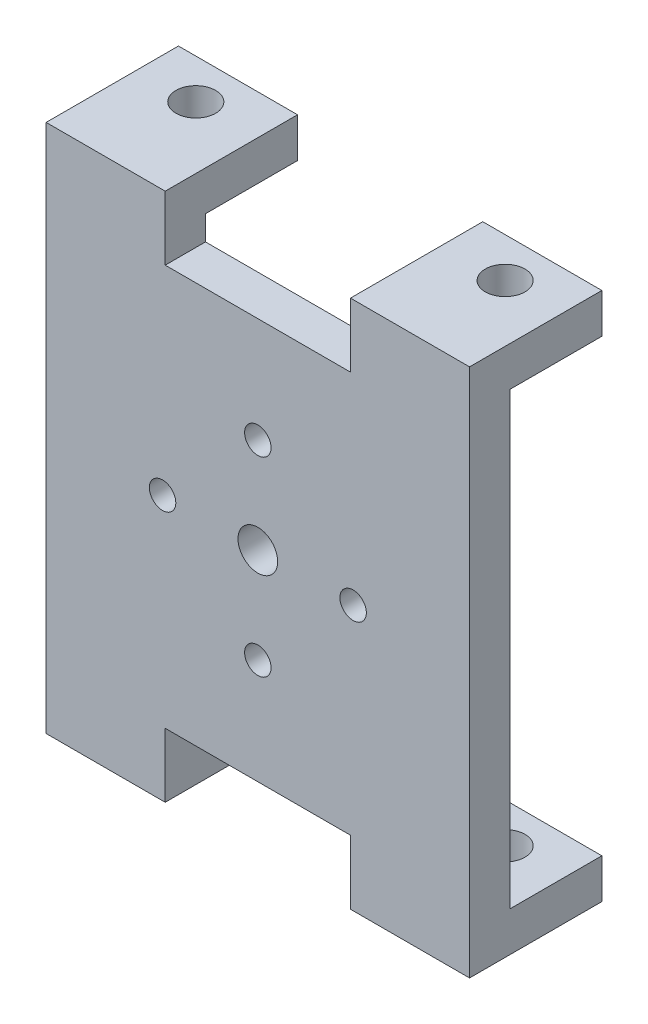
ISO-10303-21;
HEADER;
FILE_DESCRIPTION(('STEP AP214'),'2;1');
FILE_NAME('part.step','',(''),(''),'','','');
FILE_SCHEMA(('AUTOMOTIVE_DESIGN { 1 0 10303 214 1 1 1 1 }'));
ENDSEC;
DATA;
#1=APPLICATION_CONTEXT('core data for automotive mechanical design processes');
#2=APPLICATION_PROTOCOL_DEFINITION('international standard','automotive_design',2000,#1);
#3=PRODUCT_CONTEXT('',#1,'mechanical');
#4=PRODUCT('Part','Part','',(#3));
#5=PRODUCT_RELATED_PRODUCT_CATEGORY('part','',(#4));
#6=PRODUCT_DEFINITION_FORMATION('','',#4);
#7=PRODUCT_DEFINITION_CONTEXT('part definition',#1,'design');
#8=PRODUCT_DEFINITION('design','',#6,#7);
#9=PRODUCT_DEFINITION_SHAPE('','',#8);
#10=(LENGTH_UNIT() NAMED_UNIT(*) SI_UNIT(.MILLI.,.METRE.));
#11=(NAMED_UNIT(*) PLANE_ANGLE_UNIT() SI_UNIT($,.RADIAN.));
#12=(NAMED_UNIT(*) SI_UNIT($,.STERADIAN.) SOLID_ANGLE_UNIT());
#13=UNCERTAINTY_MEASURE_WITH_UNIT(LENGTH_MEASURE(1.E-05),#10,'distance_accuracy_value','');
#14=(GEOMETRIC_REPRESENTATION_CONTEXT(3) GLOBAL_UNCERTAINTY_ASSIGNED_CONTEXT((#13)) GLOBAL_UNIT_ASSIGNED_CONTEXT((#10,
#11,#12)) REPRESENTATION_CONTEXT('',''));
#15=CARTESIAN_POINT('',(0.,0.,0.));
#16=DIRECTION('',(0.,0.,1.));
#17=DIRECTION('',(1.,0.,0.));
#18=AXIS2_PLACEMENT_3D('',#15,#16,#17);
#19=CARTESIAN_POINT('',(16.,20.,-1.04357607464794));
#20=DIRECTION('',(0.,1.,0.));
#21=DIRECTION('',(-1.,0.,0.));
#22=AXIS2_PLACEMENT_3D('',#19,#20,#21);
#23=PLANE('',#22);
#24=CARTESIAN_POINT('',(-11.6894988,20.,-5.));
#25=DIRECTION('',(0.,-1.,0.));
#26=DIRECTION('',(0.,0.,-1.));
#27=AXIS2_PLACEMENT_3D('',#24,#25,#26);
#28=CIRCLE('',#27,1.5);
#29=CARTESIAN_POINT('',(-11.6894988,20.,-6.5));
#30=VERTEX_POINT('',#29);
#31=EDGE_CURVE('E370',#30,#30,#28,.T.);
#32=ORIENTED_EDGE('',*,*,#31,.T.);
#33=EDGE_LOOP('',(#32));
#34=FACE_BOUND('',#33,.T.);
#35=DIRECTION('',(-1.,0.,0.));
#36=VECTOR('',#35,1.);
#37=CARTESIAN_POINT('',(16.,20.,2.));
#38=LINE('',#37,#36);
#39=CARTESIAN_POINT('',(-7.00000000000001,20.,2.));
#40=VERTEX_POINT('',#39);
#41=CARTESIAN_POINT('',(-16.,20.,2.));
#42=VERTEX_POINT('',#41);
#43=EDGE_CURVE('E341',#40,#42,#38,.T.);
#44=ORIENTED_EDGE('',*,*,#43,.F.);
#45=DIRECTION('',(0.,0.,1.));
#46=VECTOR('',#45,1.);
#47=CARTESIAN_POINT('',(-7.00000000000001,20.,-1.04357607464794));
#48=LINE('',#47,#46);
#49=CARTESIAN_POINT('',(-7.00000000000001,20.,-8.));
#50=VERTEX_POINT('',#49);
#51=EDGE_CURVE('E282',#50,#40,#48,.T.);
#52=ORIENTED_EDGE('',*,*,#51,.F.);
#53=DIRECTION('',(-1.,0.,0.));
#54=VECTOR('',#53,1.);
#55=CARTESIAN_POINT('',(-16.,20.,-8.));
#56=LINE('',#55,#54);
#57=CARTESIAN_POINT('',(-16.,20.,-8.));
#58=VERTEX_POINT('',#57);
#59=EDGE_CURVE('E235',#50,#58,#56,.T.);
#60=ORIENTED_EDGE('',*,*,#59,.T.);
#61=DIRECTION('',(0.,0.,1.));
#62=VECTOR('',#61,1.);
#63=CARTESIAN_POINT('',(-16.,20.,-1.04357607464794));
#64=LINE('',#63,#62);
#65=EDGE_CURVE('E11',#58,#42,#64,.T.);
#66=ORIENTED_EDGE('',*,*,#65,.T.);
#67=EDGE_LOOP('',(#44,#52,#60,#66));
#68=FACE_BOUND('',#67,.T.);
#69=ADVANCED_FACE('F35',(#34,#68),#23,.T.);
#70=CARTESIAN_POINT('',(11.6894988,20.,-5.));
#71=DIRECTION('',(0.,-1.,0.));
#72=DIRECTION('',(0.,0.,-1.));
#73=AXIS2_PLACEMENT_3D('',#70,#71,#72);
#74=CIRCLE('',#73,1.5);
#75=CARTESIAN_POINT('',(11.6894988,20.,-6.5));
#76=VERTEX_POINT('',#75);
#77=EDGE_CURVE('E385',#76,#76,#74,.T.);
#78=ORIENTED_EDGE('',*,*,#77,.T.);
#79=EDGE_LOOP('',(#78));
#80=FACE_BOUND('',#79,.T.);
#81=DIRECTION('',(0.,0.,1.));
#82=VECTOR('',#81,1.);
#83=CARTESIAN_POINT('',(16.,20.,-1.04357607464794));
#84=LINE('',#83,#82);
#85=CARTESIAN_POINT('',(16.,20.,-8.));
#86=VERTEX_POINT('',#85);
#87=CARTESIAN_POINT('',(16.,20.,2.));
#88=VERTEX_POINT('',#87);
#89=EDGE_CURVE('E44',#86,#88,#84,.T.);
#90=ORIENTED_EDGE('',*,*,#89,.F.);
#91=DIRECTION('',(-1.,0.,0.));
#92=VECTOR('',#91,1.);
#93=CARTESIAN_POINT('',(7.00000000000001,20.,-8.));
#94=LINE('',#93,#92);
#95=CARTESIAN_POINT('',(7.00000000000001,20.,-8.));
#96=VERTEX_POINT('',#95);
#97=EDGE_CURVE('E253',#86,#96,#94,.T.);
#98=ORIENTED_EDGE('',*,*,#97,.T.);
#99=DIRECTION('',(0.,0.,1.));
#100=VECTOR('',#99,1.);
#101=CARTESIAN_POINT('',(7.00000000000001,20.,-1.04357607464794));
#102=LINE('',#101,#100);
#103=CARTESIAN_POINT('',(7.00000000000001,20.,2.));
#104=VERTEX_POINT('',#103);
#105=EDGE_CURVE('E286',#96,#104,#102,.T.);
#106=ORIENTED_EDGE('',*,*,#105,.T.);
#107=EDGE_CURVE('E342',#88,#104,#38,.T.);
#108=ORIENTED_EDGE('',*,*,#107,.F.);
#109=EDGE_LOOP('',(#90,#98,#106,#108));
#110=FACE_BOUND('',#109,.T.);
#111=ADVANCED_FACE('F389',(#80,#110),#23,.T.);
#112=CARTESIAN_POINT('',(16.,-20.,-1.04357607464794));
#113=DIRECTION('',(0.,-1.,0.));
#114=DIRECTION('',(1.,0.,0.));
#115=AXIS2_PLACEMENT_3D('',#112,#113,#114);
#116=PLANE('',#115);
#117=CARTESIAN_POINT('',(11.6894988,-20.,-5.));
#118=DIRECTION('',(0.,-1.,0.));
#119=DIRECTION('',(0.,0.,-1.));
#120=AXIS2_PLACEMENT_3D('',#117,#118,#119);
#121=CIRCLE('',#120,1.5);
#122=CARTESIAN_POINT('',(11.6894988,-20.,-6.5));
#123=VERTEX_POINT('',#122);
#124=EDGE_CURVE('E380',#123,#123,#121,.T.);
#125=ORIENTED_EDGE('',*,*,#124,.F.);
#126=EDGE_LOOP('',(#125));
#127=FACE_BOUND('',#126,.T.);
#128=DIRECTION('',(0.,0.,1.));
#129=VECTOR('',#128,1.);
#130=CARTESIAN_POINT('',(7.00000000000001,-20.,-1.04357607464794));
#131=LINE('',#130,#129);
#132=CARTESIAN_POINT('',(7.00000000000001,-20.,-8.));
#133=VERTEX_POINT('',#132);
#134=CARTESIAN_POINT('',(7.00000000000001,-20.,2.));
#135=VERTEX_POINT('',#134);
#136=EDGE_CURVE('E310',#133,#135,#131,.T.);
#137=ORIENTED_EDGE('',*,*,#136,.F.);
#138=DIRECTION('',(1.,0.,0.));
#139=VECTOR('',#138,1.);
#140=CARTESIAN_POINT('',(16.,-20.,-8.));
#141=LINE('',#140,#139);
#142=CARTESIAN_POINT('',(16.,-20.,-8.));
#143=VERTEX_POINT('',#142);
#144=EDGE_CURVE('E180',#133,#143,#141,.T.);
#145=ORIENTED_EDGE('',*,*,#144,.T.);
#146=DIRECTION('',(0.,0.,1.));
#147=VECTOR('',#146,1.);
#148=CARTESIAN_POINT('',(16.,-20.,-1.04357607464794));
#149=LINE('',#148,#147);
#150=CARTESIAN_POINT('',(16.,-20.,2.));
#151=VERTEX_POINT('',#150);
#152=EDGE_CURVE('E196',#143,#151,#149,.T.);
#153=ORIENTED_EDGE('',*,*,#152,.T.);
#154=DIRECTION('',(1.,0.,0.));
#155=VECTOR('',#154,1.);
#156=CARTESIAN_POINT('',(16.,-20.,2.));
#157=LINE('',#156,#155);
#158=EDGE_CURVE('E334',#135,#151,#157,.T.);
#159=ORIENTED_EDGE('',*,*,#158,.F.);
#160=EDGE_LOOP('',(#137,#145,#153,#159));
#161=FACE_BOUND('',#160,.T.);
#162=ADVANCED_FACE('F411',(#127,#161),#116,.T.);
#163=CARTESIAN_POINT('',(0.,0.,-1.04357607464794));
#164=DIRECTION('',(0.,0.,1.));
#165=DIRECTION('',(1.,0.,0.));
#166=AXIS2_PLACEMENT_3D('',#163,#164,#165);
#167=PLANE('',#166);
#168=CARTESIAN_POINT('',(0.,0.,-1.04357607464794));
#169=DIRECTION('',(0.,0.,1.));
#170=DIRECTION('',(1.,0.,0.));
#171=AXIS2_PLACEMENT_3D('',#168,#169,#170);
#172=CIRCLE('',#171,1.5);
#173=CARTESIAN_POINT('',(1.5,0.,-1.04357607464794));
#174=VERTEX_POINT('',#173);
#175=EDGE_CURVE('E326',#174,#174,#172,.T.);
#176=ORIENTED_EDGE('',*,*,#175,.T.);
#177=EDGE_LOOP('',(#176));
#178=FACE_BOUND('',#177,.T.);
#179=CARTESIAN_POINT('',(-7.19999999999989,-1.14274668185207E-13,-1.04357607464794));
#180=DIRECTION('',(0.,0.,1.));
#181=DIRECTION('',(1.,0.,0.));
#182=AXIS2_PLACEMENT_3D('',#179,#180,#181);
#183=CIRCLE('',#182,1.);
#184=CARTESIAN_POINT('',(-6.19999999999989,-1.14274668185207E-13,-1.04357607464794));
#185=VERTEX_POINT('',#184);
#186=EDGE_CURVE('E285',#185,#185,#183,.T.);
#187=ORIENTED_EDGE('',*,*,#186,.T.);
#188=EDGE_LOOP('',(#187));
#189=FACE_BOUND('',#188,.T.);
#190=CARTESIAN_POINT('',(2.26785844979641E-13,-7.2,-1.04357607464794));
#191=DIRECTION('',(0.,0.,1.));
#192=DIRECTION('',(1.,0.,0.));
#193=AXIS2_PLACEMENT_3D('',#190,#191,#192);
#194=CIRCLE('',#193,1.);
#195=CARTESIAN_POINT('',(1.00000000000023,-7.2,-1.04357607464794));
#196=VERTEX_POINT('',#195);
#197=EDGE_CURVE('E317',#196,#196,#194,.T.);
#198=ORIENTED_EDGE('',*,*,#197,.T.);
#199=EDGE_LOOP('',(#198));
#200=FACE_BOUND('',#199,.T.);
#201=CARTESIAN_POINT('',(7.20000000000011,1.13392922489821E-13,-1.04357607464794));
#202=DIRECTION('',(0.,0.,1.));
#203=DIRECTION('',(1.,0.,0.));
#204=AXIS2_PLACEMENT_3D('',#201,#202,#203);
#205=CIRCLE('',#204,1.);
#206=CARTESIAN_POINT('',(8.20000000000011,1.13392922489821E-13,-1.04357607464794));
#207=VERTEX_POINT('',#206);
#208=EDGE_CURVE('E320',#207,#207,#205,.T.);
#209=ORIENTED_EDGE('',*,*,#208,.T.);
#210=EDGE_LOOP('',(#209));
#211=FACE_BOUND('',#210,.T.);
#212=CARTESIAN_POINT('',(0.,7.2,-1.04357607464794));
#213=DIRECTION('',(0.,0.,1.));
#214=DIRECTION('',(1.,0.,0.));
#215=AXIS2_PLACEMENT_3D('',#212,#213,#214);
#216=CIRCLE('',#215,1.);
#217=CARTESIAN_POINT('',(1.,7.2,-1.04357607464794));
#218=VERTEX_POINT('',#217);
#219=EDGE_CURVE('E323',#218,#218,#216,.T.);
#220=ORIENTED_EDGE('',*,*,#219,.T.);
#221=EDGE_LOOP('',(#220));
#222=FACE_BOUND('',#221,.T.);
#223=DIRECTION('',(0.,1.,0.));
#224=VECTOR('',#223,1.);
#225=CARTESIAN_POINT('',(16.,-20.,-1.04357607464794));
#226=LINE('',#225,#224);
#227=CARTESIAN_POINT('',(16.,-17.,-1.04357607464794));
#228=VERTEX_POINT('',#227);
#229=CARTESIAN_POINT('',(16.,17.,-1.04357607464794));
#230=VERTEX_POINT('',#229);
#231=EDGE_CURVE('E348',#228,#230,#226,.T.);
#232=ORIENTED_EDGE('',*,*,#231,.F.);
#233=DIRECTION('',(-1.,0.,0.));
#234=VECTOR('',#233,1.);
#235=CARTESIAN_POINT('',(0.,-17.,-1.04357607464794));
#236=LINE('',#235,#234);
#237=CARTESIAN_POINT('',(7.00000000000001,-17.,-1.04357607464794));
#238=VERTEX_POINT('',#237);
#239=EDGE_CURVE('E176',#228,#238,#236,.T.);
#240=ORIENTED_EDGE('',*,*,#239,.T.);
#241=DIRECTION('',(0.,1.,0.));
#242=VECTOR('',#241,1.);
#243=CARTESIAN_POINT('',(7.00000000000001,0.,-1.04357607464794));
#244=LINE('',#243,#242);
#245=CARTESIAN_POINT('',(7.00000000000001,-15.1560505859225,-1.04357607464794));
#246=VERTEX_POINT('',#245);
#247=EDGE_CURVE('E301',#238,#246,#244,.T.);
#248=ORIENTED_EDGE('',*,*,#247,.T.);
#249=DIRECTION('',(-1.,0.,0.));
#250=VECTOR('',#249,1.);
#251=CARTESIAN_POINT('',(0.,-15.1560505859225,-1.04357607464794));
#252=LINE('',#251,#250);
#253=CARTESIAN_POINT('',(-7.00000000000001,-15.1560505859225,-1.04357607464794));
#254=VERTEX_POINT('',#253);
#255=EDGE_CURVE('E294',#246,#254,#252,.T.);
#256=ORIENTED_EDGE('',*,*,#255,.T.);
#257=DIRECTION('',(0.,-1.,0.));
#258=VECTOR('',#257,1.);
#259=CARTESIAN_POINT('',(-7.00000000000001,0.,-1.04357607464794));
#260=LINE('',#259,#258);
#261=CARTESIAN_POINT('',(-7.00000000000001,-17.,-1.04357607464794));
#262=VERTEX_POINT('',#261);
#263=EDGE_CURVE('E297',#254,#262,#260,.T.);
#264=ORIENTED_EDGE('',*,*,#263,.T.);
#265=DIRECTION('',(-1.,0.,0.));
#266=VECTOR('',#265,1.);
#267=CARTESIAN_POINT('',(0.,-17.,-1.04357607464794));
#268=LINE('',#267,#266);
#269=CARTESIAN_POINT('',(-16.,-17.,-1.04357607464794));
#270=VERTEX_POINT('',#269);
#271=EDGE_CURVE('E222',#262,#270,#268,.T.);
#272=ORIENTED_EDGE('',*,*,#271,.T.);
#273=DIRECTION('',(0.,-1.,0.));
#274=VECTOR('',#273,1.);
#275=CARTESIAN_POINT('',(-16.,-20.,-1.04357607464794));
#276=LINE('',#275,#274);
#277=CARTESIAN_POINT('',(-16.,17.,-1.04357607464794));
#278=VERTEX_POINT('',#277);
#279=EDGE_CURVE('E345',#278,#270,#276,.T.);
#280=ORIENTED_EDGE('',*,*,#279,.F.);
#281=DIRECTION('',(1.,0.,0.));
#282=VECTOR('',#281,1.);
#283=CARTESIAN_POINT('',(0.,17.,-1.04357607464794));
#284=LINE('',#283,#282);
#285=CARTESIAN_POINT('',(-7.00000000000001,17.,-1.04357607464794));
#286=VERTEX_POINT('',#285);
#287=EDGE_CURVE('E240',#278,#286,#284,.T.);
#288=ORIENTED_EDGE('',*,*,#287,.T.);
#289=DIRECTION('',(0.,1.,0.));
#290=VECTOR('',#289,1.);
#291=CARTESIAN_POINT('',(-7.00000000000001,0.,-1.04357607464794));
#292=LINE('',#291,#290);
#293=CARTESIAN_POINT('',(-7.00000000000001,15.1560505859225,-1.04357607464794));
#294=VERTEX_POINT('',#293);
#295=EDGE_CURVE('E266',#294,#286,#292,.T.);
#296=ORIENTED_EDGE('',*,*,#295,.F.);
#297=DIRECTION('',(-1.,0.,0.));
#298=VECTOR('',#297,1.);
#299=CARTESIAN_POINT('',(0.,15.1560505859225,-1.04357607464794));
#300=LINE('',#299,#298);
#301=CARTESIAN_POINT('',(7.00000000000001,15.1560505859225,-1.04357607464794));
#302=VERTEX_POINT('',#301);
#303=EDGE_CURVE('E269',#302,#294,#300,.T.);
#304=ORIENTED_EDGE('',*,*,#303,.F.);
#305=DIRECTION('',(0.,-1.,0.));
#306=VECTOR('',#305,1.);
#307=CARTESIAN_POINT('',(7.00000000000001,0.,-1.04357607464794));
#308=LINE('',#307,#306);
#309=CARTESIAN_POINT('',(7.00000000000001,17.,-1.04357607464794));
#310=VERTEX_POINT('',#309);
#311=EDGE_CURVE('E272',#310,#302,#308,.T.);
#312=ORIENTED_EDGE('',*,*,#311,.F.);
#313=DIRECTION('',(1.,0.,0.));
#314=VECTOR('',#313,1.);
#315=CARTESIAN_POINT('',(0.,17.,-1.04357607464794));
#316=LINE('',#315,#314);
#317=EDGE_CURVE('E260',#310,#230,#316,.T.);
#318=ORIENTED_EDGE('',*,*,#317,.T.);
#319=EDGE_LOOP('',(#232,#240,#248,#256,#264,#272,#280,#288,#296,#304,#312,#318));
#320=FACE_BOUND('',#319,.T.);
#321=ADVANCED_FACE('F415',(#178,#189,#200,#211,#222,#320),#167,.F.);
#322=CARTESIAN_POINT('',(0.,0.,2.));
#323=DIRECTION('',(0.,0.,1.));
#324=DIRECTION('',(1.,0.,0.));
#325=AXIS2_PLACEMENT_3D('',#322,#323,#324);
#326=PLANE('',#325);
#327=DIRECTION('',(-1.,0.,0.));
#328=VECTOR('',#327,1.);
#329=CARTESIAN_POINT('',(0.,-15.1560505859225,2.));
#330=LINE('',#329,#328);
#331=CARTESIAN_POINT('',(7.00000000000001,-15.1560505859225,2.));
#332=VERTEX_POINT('',#331);
#333=CARTESIAN_POINT('',(-7.00000000000001,-15.1560505859225,2.));
#334=VERTEX_POINT('',#333);
#335=EDGE_CURVE('E265',#332,#334,#330,.T.);
#336=ORIENTED_EDGE('',*,*,#335,.F.);
#337=DIRECTION('',(0.,1.,0.));
#338=VECTOR('',#337,1.);
#339=CARTESIAN_POINT('',(7.00000000000001,0.,2.));
#340=LINE('',#339,#338);
#341=EDGE_CURVE('E298',#135,#332,#340,.T.);
#342=ORIENTED_EDGE('',*,*,#341,.F.);
#343=ORIENTED_EDGE('',*,*,#158,.T.);
#344=DIRECTION('',(0.,1.,0.));
#345=VECTOR('',#344,1.);
#346=CARTESIAN_POINT('',(16.,-20.,2.));
#347=LINE('',#346,#345);
#348=EDGE_CURVE('E339',#151,#88,#347,.T.);
#349=ORIENTED_EDGE('',*,*,#348,.T.);
#350=ORIENTED_EDGE('',*,*,#107,.T.);
#351=DIRECTION('',(0.,-1.,0.));
#352=VECTOR('',#351,1.);
#353=CARTESIAN_POINT('',(7.00000000000001,0.,2.));
#354=LINE('',#353,#352);
#355=CARTESIAN_POINT('',(7.00000000000001,15.1560505859225,2.));
#356=VERTEX_POINT('',#355);
#357=EDGE_CURVE('E270',#104,#356,#354,.T.);
#358=ORIENTED_EDGE('',*,*,#357,.T.);
#359=DIRECTION('',(-1.,0.,0.));
#360=VECTOR('',#359,1.);
#361=CARTESIAN_POINT('',(0.,15.1560505859225,2.));
#362=LINE('',#361,#360);
#363=CARTESIAN_POINT('',(-7.00000000000001,15.1560505859225,2.));
#364=VERTEX_POINT('',#363);
#365=EDGE_CURVE('E277',#356,#364,#362,.T.);
#366=ORIENTED_EDGE('',*,*,#365,.T.);
#367=DIRECTION('',(0.,1.,0.));
#368=VECTOR('',#367,1.);
#369=CARTESIAN_POINT('',(-7.00000000000001,0.,2.));
#370=LINE('',#369,#368);
#371=EDGE_CURVE('E275',#364,#40,#370,.T.);
#372=ORIENTED_EDGE('',*,*,#371,.T.);
#373=ORIENTED_EDGE('',*,*,#43,.T.);
#374=DIRECTION('',(0.,-1.,0.));
#375=VECTOR('',#374,1.);
#376=CARTESIAN_POINT('',(-16.,-20.,2.));
#377=LINE('',#376,#375);
#378=CARTESIAN_POINT('',(-16.,-20.,2.));
#379=VERTEX_POINT('',#378);
#380=EDGE_CURVE('E332',#42,#379,#377,.T.);
#381=ORIENTED_EDGE('',*,*,#380,.T.);
#382=CARTESIAN_POINT('',(-7.00000000000001,-20.,2.));
#383=VERTEX_POINT('',#382);
#384=EDGE_CURVE('E336',#379,#383,#157,.T.);
#385=ORIENTED_EDGE('',*,*,#384,.T.);
#386=DIRECTION('',(0.,-1.,0.));
#387=VECTOR('',#386,1.);
#388=CARTESIAN_POINT('',(-7.00000000000001,0.,2.));
#389=LINE('',#388,#387);
#390=EDGE_CURVE('E305',#334,#383,#389,.T.);
#391=ORIENTED_EDGE('',*,*,#390,.F.);
#392=EDGE_LOOP('',(#336,#342,#343,#349,#350,#358,#366,#372,#373,#381,#385,#391));
#393=FACE_BOUND('',#392,.T.);
#394=CARTESIAN_POINT('',(0.,7.2,2.));
#395=DIRECTION('',(0.,0.,1.));
#396=DIRECTION('',(1.,0.,0.));
#397=AXIS2_PLACEMENT_3D('',#394,#395,#396);
#398=CIRCLE('',#397,1.);
#399=CARTESIAN_POINT('',(1.,7.2,2.));
#400=VERTEX_POINT('',#399);
#401=EDGE_CURVE('E335',#400,#400,#398,.T.);
#402=ORIENTED_EDGE('',*,*,#401,.F.);
#403=EDGE_LOOP('',(#402));
#404=FACE_BOUND('',#403,.T.);
#405=CARTESIAN_POINT('',(7.20000000000011,1.13392922489821E-13,2.));
#406=DIRECTION('',(0.,0.,1.));
#407=DIRECTION('',(1.,0.,0.));
#408=AXIS2_PLACEMENT_3D('',#405,#406,#407);
#409=CIRCLE('',#408,1.);
#410=CARTESIAN_POINT('',(8.20000000000011,1.13392922489821E-13,2.));
#411=VERTEX_POINT('',#410);
#412=EDGE_CURVE('E363',#411,#411,#409,.T.);
#413=ORIENTED_EDGE('',*,*,#412,.F.);
#414=EDGE_LOOP('',(#413));
#415=FACE_BOUND('',#414,.T.);
#416=CARTESIAN_POINT('',(2.26785844979641E-13,-7.2,2.));
#417=DIRECTION('',(0.,0.,1.));
#418=DIRECTION('',(1.,0.,0.));
#419=AXIS2_PLACEMENT_3D('',#416,#417,#418);
#420=CIRCLE('',#419,1.);
#421=CARTESIAN_POINT('',(1.00000000000023,-7.2,2.));
#422=VERTEX_POINT('',#421);
#423=EDGE_CURVE('E360',#422,#422,#420,.T.);
#424=ORIENTED_EDGE('',*,*,#423,.F.);
#425=EDGE_LOOP('',(#424));
#426=FACE_BOUND('',#425,.T.);
#427=CARTESIAN_POINT('',(-7.19999999999989,-1.14274668185207E-13,2.));
#428=DIRECTION('',(0.,0.,1.));
#429=DIRECTION('',(1.,0.,0.));
#430=AXIS2_PLACEMENT_3D('',#427,#428,#429);
#431=CIRCLE('',#430,1.);
#432=CARTESIAN_POINT('',(-6.19999999999989,-1.14274668185207E-13,2.));
#433=VERTEX_POINT('',#432);
#434=EDGE_CURVE('E357',#433,#433,#431,.T.);
#435=ORIENTED_EDGE('',*,*,#434,.F.);
#436=EDGE_LOOP('',(#435));
#437=FACE_BOUND('',#436,.T.);
#438=CARTESIAN_POINT('',(0.,0.,2.));
#439=DIRECTION('',(0.,0.,1.));
#440=DIRECTION('',(1.,0.,0.));
#441=AXIS2_PLACEMENT_3D('',#438,#439,#440);
#442=CIRCLE('',#441,1.5);
#443=CARTESIAN_POINT('',(1.5,0.,2.));
#444=VERTEX_POINT('',#443);
#445=EDGE_CURVE('E331',#444,#444,#442,.T.);
#446=ORIENTED_EDGE('',*,*,#445,.F.);
#447=EDGE_LOOP('',(#446));
#448=FACE_BOUND('',#447,.T.);
#449=ADVANCED_FACE('F435',(#393,#404,#415,#426,#437,#448),#326,.T.);
#450=CARTESIAN_POINT('',(-16.,-20.,-1.04357607464794));
#451=DIRECTION('',(-1.,0.,0.));
#452=DIRECTION('',(0.,0.,1.));
#453=AXIS2_PLACEMENT_3D('',#450,#451,#452);
#454=PLANE('',#453);
#455=ORIENTED_EDGE('',*,*,#279,.T.);
#456=DIRECTION('',(0.,0.,1.));
#457=VECTOR('',#456,1.);
#458=CARTESIAN_POINT('',(-16.,-17.,-8.));
#459=LINE('',#458,#457);
#460=CARTESIAN_POINT('',(-16.,-17.,-8.));
#461=VERTEX_POINT('',#460);
#462=EDGE_CURVE('E220',#461,#270,#459,.T.);
#463=ORIENTED_EDGE('',*,*,#462,.F.);
#464=DIRECTION('',(0.,-1.,0.));
#465=VECTOR('',#464,1.);
#466=CARTESIAN_POINT('',(-16.,-20.,-8.));
#467=LINE('',#466,#465);
#468=CARTESIAN_POINT('',(-16.,-20.,-8.));
#469=VERTEX_POINT('',#468);
#470=EDGE_CURVE('E207',#461,#469,#467,.T.);
#471=ORIENTED_EDGE('',*,*,#470,.T.);
#472=DIRECTION('',(0.,0.,1.));
#473=VECTOR('',#472,1.);
#474=CARTESIAN_POINT('',(-16.,-20.,-1.04357607464794));
#475=LINE('',#474,#473);
#476=EDGE_CURVE('E349',#469,#379,#475,.T.);
#477=ORIENTED_EDGE('',*,*,#476,.T.);
#478=ORIENTED_EDGE('',*,*,#380,.F.);
#479=ORIENTED_EDGE('',*,*,#65,.F.);
#480=DIRECTION('',(0.,-1.,0.));
#481=VECTOR('',#480,1.);
#482=CARTESIAN_POINT('',(-16.,20.,-8.));
#483=LINE('',#482,#481);
#484=CARTESIAN_POINT('',(-16.,17.,-8.));
#485=VERTEX_POINT('',#484);
#486=EDGE_CURVE('E227',#58,#485,#483,.T.);
#487=ORIENTED_EDGE('',*,*,#486,.T.);
#488=DIRECTION('',(0.,0.,1.));
#489=VECTOR('',#488,1.);
#490=CARTESIAN_POINT('',(-16.,17.,-8.));
#491=LINE('',#490,#489);
#492=EDGE_CURVE('E238',#485,#278,#491,.T.);
#493=ORIENTED_EDGE('',*,*,#492,.T.);
#494=EDGE_LOOP('',(#455,#463,#471,#477,#478,#479,#487,#493));
#495=FACE_BOUND('',#494,.T.);
#496=ADVANCED_FACE('F37',(#495),#454,.T.);
#497=CARTESIAN_POINT('',(16.,-20.,-1.04357607464794));
#498=DIRECTION('',(1.,0.,0.));
#499=DIRECTION('',(0.,0.,-1.));
#500=AXIS2_PLACEMENT_3D('',#497,#498,#499);
#501=PLANE('',#500);
#502=ORIENTED_EDGE('',*,*,#89,.T.);
#503=ORIENTED_EDGE('',*,*,#348,.F.);
#504=ORIENTED_EDGE('',*,*,#152,.F.);
#505=DIRECTION('',(0.,1.,0.));
#506=VECTOR('',#505,1.);
#507=CARTESIAN_POINT('',(16.,-20.,-8.));
#508=LINE('',#507,#506);
#509=CARTESIAN_POINT('',(16.,-17.,-8.));
#510=VERTEX_POINT('',#509);
#511=EDGE_CURVE('E187',#143,#510,#508,.T.);
#512=ORIENTED_EDGE('',*,*,#511,.T.);
#513=DIRECTION('',(0.,0.,1.));
#514=VECTOR('',#513,1.);
#515=CARTESIAN_POINT('',(16.,-17.,-8.));
#516=LINE('',#515,#514);
#517=EDGE_CURVE('E172',#510,#228,#516,.T.);
#518=ORIENTED_EDGE('',*,*,#517,.T.);
#519=ORIENTED_EDGE('',*,*,#231,.T.);
#520=DIRECTION('',(0.,0.,1.));
#521=VECTOR('',#520,1.);
#522=CARTESIAN_POINT('',(16.,17.,-8.));
#523=LINE('',#522,#521);
#524=CARTESIAN_POINT('',(16.,17.,-8.));
#525=VERTEX_POINT('',#524);
#526=EDGE_CURVE('E257',#525,#230,#523,.T.);
#527=ORIENTED_EDGE('',*,*,#526,.F.);
#528=DIRECTION('',(0.,1.,0.));
#529=VECTOR('',#528,1.);
#530=CARTESIAN_POINT('',(16.,20.,-8.));
#531=LINE('',#530,#529);
#532=EDGE_CURVE('E250',#525,#86,#531,.T.);
#533=ORIENTED_EDGE('',*,*,#532,.T.);
#534=EDGE_LOOP('',(#502,#503,#504,#512,#518,#519,#527,#533));
#535=FACE_BOUND('',#534,.T.);
#536=ADVANCED_FACE('F193',(#535),#501,.T.);
#537=CARTESIAN_POINT('',(-11.6894988,-20.,-5.));
#538=DIRECTION('',(0.,-1.,0.));
#539=DIRECTION('',(0.,0.,-1.));
#540=AXIS2_PLACEMENT_3D('',#537,#538,#539);
#541=CIRCLE('',#540,1.5);
#542=CARTESIAN_POINT('',(-11.6894988,-20.,-6.5));
#543=VERTEX_POINT('',#542);
#544=EDGE_CURVE('E375',#543,#543,#541,.T.);
#545=ORIENTED_EDGE('',*,*,#544,.F.);
#546=EDGE_LOOP('',(#545));
#547=FACE_BOUND('',#546,.T.);
#548=DIRECTION('',(0.,0.,1.));
#549=VECTOR('',#548,1.);
#550=CARTESIAN_POINT('',(-7.00000000000001,-20.,-1.04357607464794));
#551=LINE('',#550,#549);
#552=CARTESIAN_POINT('',(-7.00000000000001,-20.,-8.));
#553=VERTEX_POINT('',#552);
#554=EDGE_CURVE('E312',#553,#383,#551,.T.);
#555=ORIENTED_EDGE('',*,*,#554,.T.);
#556=ORIENTED_EDGE('',*,*,#384,.F.);
#557=ORIENTED_EDGE('',*,*,#476,.F.);
#558=DIRECTION('',(1.,0.,0.));
#559=VECTOR('',#558,1.);
#560=CARTESIAN_POINT('',(-16.,-20.,-8.));
#561=LINE('',#560,#559);
#562=EDGE_CURVE('E210',#469,#553,#561,.T.);
#563=ORIENTED_EDGE('',*,*,#562,.T.);
#564=EDGE_LOOP('',(#555,#556,#557,#563));
#565=FACE_BOUND('',#564,.T.);
#566=ADVANCED_FACE('F418',(#547,#565),#116,.T.);
#567=CARTESIAN_POINT('',(0.,0.,-1.04357607464794));
#568=DIRECTION('',(0.,0.,1.));
#569=DIRECTION('',(1.,0.,0.));
#570=AXIS2_PLACEMENT_3D('',#567,#568,#569);
#571=CYLINDRICAL_SURFACE('',#570,1.5);
#572=ORIENTED_EDGE('',*,*,#445,.T.);
#573=EDGE_LOOP('',(#572));
#574=FACE_BOUND('',#573,.T.);
#575=ORIENTED_EDGE('',*,*,#175,.F.);
#576=EDGE_LOOP('',(#575));
#577=FACE_BOUND('',#576,.T.);
#578=ADVANCED_FACE('F420',(#574,#577),#571,.F.);
#579=CARTESIAN_POINT('',(-7.19999999999989,-1.14274668185207E-13,-1.04357607464794));
#580=DIRECTION('',(0.,0.,1.));
#581=DIRECTION('',(1.,0.,0.));
#582=AXIS2_PLACEMENT_3D('',#579,#580,#581);
#583=CYLINDRICAL_SURFACE('',#582,1.);
#584=ORIENTED_EDGE('',*,*,#434,.T.);
#585=EDGE_LOOP('',(#584));
#586=FACE_BOUND('',#585,.T.);
#587=ORIENTED_EDGE('',*,*,#186,.F.);
#588=EDGE_LOOP('',(#587));
#589=FACE_BOUND('',#588,.T.);
#590=ADVANCED_FACE('F425',(#586,#589),#583,.F.);
#591=CARTESIAN_POINT('',(2.26785844979641E-13,-7.2,-1.04357607464794));
#592=DIRECTION('',(0.,0.,1.));
#593=DIRECTION('',(1.,0.,0.));
#594=AXIS2_PLACEMENT_3D('',#591,#592,#593);
#595=CYLINDRICAL_SURFACE('',#594,1.);
#596=ORIENTED_EDGE('',*,*,#423,.T.);
#597=EDGE_LOOP('',(#596));
#598=FACE_BOUND('',#597,.T.);
#599=ORIENTED_EDGE('',*,*,#197,.F.);
#600=EDGE_LOOP('',(#599));
#601=FACE_BOUND('',#600,.T.);
#602=ADVANCED_FACE('F530',(#598,#601),#595,.F.);
#603=CARTESIAN_POINT('',(7.20000000000011,1.13392922489821E-13,-1.04357607464794));
#604=DIRECTION('',(0.,0.,1.));
#605=DIRECTION('',(1.,0.,0.));
#606=AXIS2_PLACEMENT_3D('',#603,#604,#605);
#607=CYLINDRICAL_SURFACE('',#606,1.);
#608=ORIENTED_EDGE('',*,*,#412,.T.);
#609=EDGE_LOOP('',(#608));
#610=FACE_BOUND('',#609,.T.);
#611=ORIENTED_EDGE('',*,*,#208,.F.);
#612=EDGE_LOOP('',(#611));
#613=FACE_BOUND('',#612,.T.);
#614=ADVANCED_FACE('F533',(#610,#613),#607,.F.);
#615=CARTESIAN_POINT('',(0.,7.2,-1.04357607464794));
#616=DIRECTION('',(0.,0.,1.));
#617=DIRECTION('',(1.,0.,0.));
#618=AXIS2_PLACEMENT_3D('',#615,#616,#617);
#619=CYLINDRICAL_SURFACE('',#618,1.);
#620=ORIENTED_EDGE('',*,*,#401,.T.);
#621=EDGE_LOOP('',(#620));
#622=FACE_BOUND('',#621,.T.);
#623=ORIENTED_EDGE('',*,*,#219,.F.);
#624=EDGE_LOOP('',(#623));
#625=FACE_BOUND('',#624,.T.);
#626=ADVANCED_FACE('F529',(#622,#625),#619,.F.);
#627=CARTESIAN_POINT('',(0.,-15.1560505859225,-1.04357607464794));
#628=DIRECTION('',(0.,1.,0.));
#629=DIRECTION('',(0.,0.,1.));
#630=AXIS2_PLACEMENT_3D('',#627,#628,#629);
#631=PLANE('',#630);
#632=ORIENTED_EDGE('',*,*,#335,.T.);
#633=DIRECTION('',(0.,0.,1.));
#634=VECTOR('',#633,1.);
#635=CARTESIAN_POINT('',(-7.00000000000001,-15.1560505859225,-1.04357607464794));
#636=LINE('',#635,#634);
#637=EDGE_CURVE('E303',#254,#334,#636,.T.);
#638=ORIENTED_EDGE('',*,*,#637,.F.);
#639=ORIENTED_EDGE('',*,*,#255,.F.);
#640=DIRECTION('',(0.,0.,1.));
#641=VECTOR('',#640,1.);
#642=CARTESIAN_POINT('',(7.00000000000001,-15.1560505859225,-1.04357607464794));
#643=LINE('',#642,#641);
#644=EDGE_CURVE('E278',#246,#332,#643,.T.);
#645=ORIENTED_EDGE('',*,*,#644,.T.);
#646=EDGE_LOOP('',(#632,#638,#639,#645));
#647=FACE_BOUND('',#646,.T.);
#648=ADVANCED_FACE('F464',(#647),#631,.F.);
#649=CARTESIAN_POINT('',(7.00000000000001,0.,-1.04357607464794));
#650=DIRECTION('',(1.,0.,0.));
#651=DIRECTION('',(0.,1.,0.));
#652=AXIS2_PLACEMENT_3D('',#649,#650,#651);
#653=PLANE('',#652);
#654=ORIENTED_EDGE('',*,*,#247,.F.);
#655=DIRECTION('',(0.,0.,1.));
#656=VECTOR('',#655,1.);
#657=CARTESIAN_POINT('',(7.00000000000001,-17.,-8.));
#658=LINE('',#657,#656);
#659=CARTESIAN_POINT('',(7.00000000000001,-17.,-8.));
#660=VERTEX_POINT('',#659);
#661=EDGE_CURVE('E52',#660,#238,#658,.T.);
#662=ORIENTED_EDGE('',*,*,#661,.F.);
#663=DIRECTION('',(0.,-1.,0.));
#664=VECTOR('',#663,1.);
#665=CARTESIAN_POINT('',(7.00000000000001,-20.,-8.));
#666=LINE('',#665,#664);
#667=EDGE_CURVE('E190',#660,#133,#666,.T.);
#668=ORIENTED_EDGE('',*,*,#667,.T.);
#669=ORIENTED_EDGE('',*,*,#136,.T.);
#670=ORIENTED_EDGE('',*,*,#341,.T.);
#671=ORIENTED_EDGE('',*,*,#644,.F.);
#672=EDGE_LOOP('',(#654,#662,#668,#669,#670,#671));
#673=FACE_BOUND('',#672,.T.);
#674=ADVANCED_FACE('F443',(#673),#653,.F.);
#675=CARTESIAN_POINT('',(-7.00000000000001,0.,-1.04357607464794));
#676=DIRECTION('',(-1.,0.,0.));
#677=DIRECTION('',(0.,-1.,0.));
#678=AXIS2_PLACEMENT_3D('',#675,#676,#677);
#679=PLANE('',#678);
#680=ORIENTED_EDGE('',*,*,#390,.T.);
#681=ORIENTED_EDGE('',*,*,#554,.F.);
#682=DIRECTION('',(0.,1.,0.));
#683=VECTOR('',#682,1.);
#684=CARTESIAN_POINT('',(-7.00000000000001,-20.,-8.));
#685=LINE('',#684,#683);
#686=CARTESIAN_POINT('',(-7.00000000000001,-17.,-8.));
#687=VERTEX_POINT('',#686);
#688=EDGE_CURVE('E213',#553,#687,#685,.T.);
#689=ORIENTED_EDGE('',*,*,#688,.T.);
#690=DIRECTION('',(0.,0.,1.));
#691=VECTOR('',#690,1.);
#692=CARTESIAN_POINT('',(-7.00000000000001,-17.,-8.));
#693=LINE('',#692,#691);
#694=EDGE_CURVE('E219',#687,#262,#693,.T.);
#695=ORIENTED_EDGE('',*,*,#694,.T.);
#696=ORIENTED_EDGE('',*,*,#263,.F.);
#697=ORIENTED_EDGE('',*,*,#637,.T.);
#698=EDGE_LOOP('',(#680,#681,#689,#695,#696,#697));
#699=FACE_BOUND('',#698,.T.);
#700=ADVANCED_FACE('F467',(#699),#679,.F.);
#701=CARTESIAN_POINT('',(-7.00000000000001,0.,-1.04357607464794));
#702=DIRECTION('',(1.,0.,0.));
#703=DIRECTION('',(0.,1.,0.));
#704=AXIS2_PLACEMENT_3D('',#701,#702,#703);
#705=PLANE('',#704);
#706=ORIENTED_EDGE('',*,*,#295,.T.);
#707=DIRECTION('',(0.,0.,1.));
#708=VECTOR('',#707,1.);
#709=CARTESIAN_POINT('',(-7.00000000000001,17.,-8.));
#710=LINE('',#709,#708);
#711=CARTESIAN_POINT('',(-7.00000000000001,17.,-8.));
#712=VERTEX_POINT('',#711);
#713=EDGE_CURVE('E60',#712,#286,#710,.T.);
#714=ORIENTED_EDGE('',*,*,#713,.F.);
#715=DIRECTION('',(0.,1.,0.));
#716=VECTOR('',#715,1.);
#717=CARTESIAN_POINT('',(-7.00000000000001,20.,-8.));
#718=LINE('',#717,#716);
#719=EDGE_CURVE('E232',#712,#50,#718,.T.);
#720=ORIENTED_EDGE('',*,*,#719,.T.);
#721=ORIENTED_EDGE('',*,*,#51,.T.);
#722=ORIENTED_EDGE('',*,*,#371,.F.);
#723=DIRECTION('',(0.,0.,1.));
#724=VECTOR('',#723,1.);
#725=CARTESIAN_POINT('',(-7.00000000000001,15.1560505859225,-1.04357607464794));
#726=LINE('',#725,#724);
#727=EDGE_CURVE('E274',#294,#364,#726,.T.);
#728=ORIENTED_EDGE('',*,*,#727,.F.);
#729=EDGE_LOOP('',(#706,#714,#720,#721,#722,#728));
#730=FACE_BOUND('',#729,.T.);
#731=ADVANCED_FACE('F480',(#730),#705,.T.);
#732=CARTESIAN_POINT('',(7.00000000000001,0.,-1.04357607464794));
#733=DIRECTION('',(-1.,0.,0.));
#734=DIRECTION('',(0.,0.,1.));
#735=AXIS2_PLACEMENT_3D('',#732,#733,#734);
#736=PLANE('',#735);
#737=DIRECTION('',(0.,0.,1.));
#738=VECTOR('',#737,1.);
#739=CARTESIAN_POINT('',(7.00000000000001,15.1560505859225,-1.04357607464794));
#740=LINE('',#739,#738);
#741=EDGE_CURVE('E289',#302,#356,#740,.T.);
#742=ORIENTED_EDGE('',*,*,#741,.T.);
#743=ORIENTED_EDGE('',*,*,#357,.F.);
#744=ORIENTED_EDGE('',*,*,#105,.F.);
#745=DIRECTION('',(0.,-1.,0.));
#746=VECTOR('',#745,1.);
#747=CARTESIAN_POINT('',(7.00000000000001,20.,-8.));
#748=LINE('',#747,#746);
#749=CARTESIAN_POINT('',(7.00000000000001,17.,-8.));
#750=VERTEX_POINT('',#749);
#751=EDGE_CURVE('E244',#96,#750,#748,.T.);
#752=ORIENTED_EDGE('',*,*,#751,.T.);
#753=DIRECTION('',(0.,0.,1.));
#754=VECTOR('',#753,1.);
#755=CARTESIAN_POINT('',(7.00000000000001,17.,-8.));
#756=LINE('',#755,#754);
#757=EDGE_CURVE('E256',#750,#310,#756,.T.);
#758=ORIENTED_EDGE('',*,*,#757,.T.);
#759=ORIENTED_EDGE('',*,*,#311,.T.);
#760=EDGE_LOOP('',(#742,#743,#744,#752,#758,#759));
#761=FACE_BOUND('',#760,.T.);
#762=ADVANCED_FACE('F457',(#761),#736,.T.);
#763=CARTESIAN_POINT('',(0.,15.1560505859225,-1.04357607464794));
#764=DIRECTION('',(0.,1.,0.));
#765=DIRECTION('',(0.,0.,1.));
#766=AXIS2_PLACEMENT_3D('',#763,#764,#765);
#767=PLANE('',#766);
#768=ORIENTED_EDGE('',*,*,#365,.F.);
#769=ORIENTED_EDGE('',*,*,#741,.F.);
#770=ORIENTED_EDGE('',*,*,#303,.T.);
#771=ORIENTED_EDGE('',*,*,#727,.T.);
#772=EDGE_LOOP('',(#768,#769,#770,#771));
#773=FACE_BOUND('',#772,.T.);
#774=ADVANCED_FACE('F488',(#773),#767,.T.);
#775=CARTESIAN_POINT('',(7.00000000000001,17.,-8.));
#776=DIRECTION('',(0.,-1.,0.));
#777=DIRECTION('',(0.,0.,-1.));
#778=AXIS2_PLACEMENT_3D('',#775,#776,#777);
#779=PLANE('',#778);
#780=CARTESIAN_POINT('',(11.6894988,17.,-5.));
#781=DIRECTION('',(0.,-1.,0.));
#782=DIRECTION('',(0.,0.,-1.));
#783=AXIS2_PLACEMENT_3D('',#780,#781,#782);
#784=CIRCLE('',#783,1.5);
#785=CARTESIAN_POINT('',(11.6894988,17.,-6.5));
#786=VERTEX_POINT('',#785);
#787=EDGE_CURVE('E369',#786,#786,#784,.T.);
#788=ORIENTED_EDGE('',*,*,#787,.F.);
#789=EDGE_LOOP('',(#788));
#790=FACE_BOUND('',#789,.T.);
#791=ORIENTED_EDGE('',*,*,#317,.F.);
#792=ORIENTED_EDGE('',*,*,#757,.F.);
#793=DIRECTION('',(1.,0.,0.));
#794=VECTOR('',#793,1.);
#795=CARTESIAN_POINT('',(7.00000000000001,17.,-8.));
#796=LINE('',#795,#794);
#797=EDGE_CURVE('E247',#750,#525,#796,.T.);
#798=ORIENTED_EDGE('',*,*,#797,.T.);
#799=ORIENTED_EDGE('',*,*,#526,.T.);
#800=EDGE_LOOP('',(#791,#792,#798,#799));
#801=FACE_BOUND('',#800,.T.);
#802=ADVANCED_FACE('F450',(#790,#801),#779,.T.);
#803=CARTESIAN_POINT('',(0.,0.,-8.));
#804=DIRECTION('',(0.,0.,1.));
#805=DIRECTION('',(1.,0.,0.));
#806=AXIS2_PLACEMENT_3D('',#803,#804,#805);
#807=PLANE('',#806);
#808=ORIENTED_EDGE('',*,*,#751,.F.);
#809=ORIENTED_EDGE('',*,*,#97,.F.);
#810=ORIENTED_EDGE('',*,*,#532,.F.);
#811=ORIENTED_EDGE('',*,*,#797,.F.);
#812=EDGE_LOOP('',(#808,#809,#810,#811));
#813=FACE_BOUND('',#812,.T.);
#814=ADVANCED_FACE('F454',(#813),#807,.F.);
#815=CARTESIAN_POINT('',(-16.,17.,-8.));
#816=DIRECTION('',(0.,-1.,0.));
#817=DIRECTION('',(0.,0.,-1.));
#818=AXIS2_PLACEMENT_3D('',#815,#816,#817);
#819=PLANE('',#818);
#820=CARTESIAN_POINT('',(-11.6894988,17.,-5.));
#821=DIRECTION('',(0.,-1.,0.));
#822=DIRECTION('',(0.,0.,-1.));
#823=AXIS2_PLACEMENT_3D('',#820,#821,#822);
#824=CIRCLE('',#823,1.5);
#825=CARTESIAN_POINT('',(-11.6894988,17.,-6.5));
#826=VERTEX_POINT('',#825);
#827=EDGE_CURVE('E197',#826,#826,#824,.T.);
#828=ORIENTED_EDGE('',*,*,#827,.F.);
#829=EDGE_LOOP('',(#828));
#830=FACE_BOUND('',#829,.T.);
#831=ORIENTED_EDGE('',*,*,#287,.F.);
#832=ORIENTED_EDGE('',*,*,#492,.F.);
#833=DIRECTION('',(1.,0.,0.));
#834=VECTOR('',#833,1.);
#835=CARTESIAN_POINT('',(-16.,17.,-8.));
#836=LINE('',#835,#834);
#837=EDGE_CURVE('E230',#485,#712,#836,.T.);
#838=ORIENTED_EDGE('',*,*,#837,.T.);
#839=ORIENTED_EDGE('',*,*,#713,.T.);
#840=EDGE_LOOP('',(#831,#832,#838,#839));
#841=FACE_BOUND('',#840,.T.);
#842=ADVANCED_FACE('F474',(#830,#841),#819,.T.);
#843=CARTESIAN_POINT('',(0.,0.,-8.));
#844=DIRECTION('',(0.,0.,1.));
#845=DIRECTION('',(1.,0.,0.));
#846=AXIS2_PLACEMENT_3D('',#843,#844,#845);
#847=PLANE('',#846);
#848=ORIENTED_EDGE('',*,*,#486,.F.);
#849=ORIENTED_EDGE('',*,*,#59,.F.);
#850=ORIENTED_EDGE('',*,*,#719,.F.);
#851=ORIENTED_EDGE('',*,*,#837,.F.);
#852=EDGE_LOOP('',(#848,#849,#850,#851));
#853=FACE_BOUND('',#852,.T.);
#854=ADVANCED_FACE('F477',(#853),#847,.F.);
#855=CARTESIAN_POINT('',(-16.,-17.,-8.));
#856=DIRECTION('',(0.,1.,0.));
#857=DIRECTION('',(0.,0.,1.));
#858=AXIS2_PLACEMENT_3D('',#855,#856,#857);
#859=PLANE('',#858);
#860=CARTESIAN_POINT('',(-11.6894988,-17.,-5.));
#861=DIRECTION('',(0.,1.,0.));
#862=DIRECTION('',(0.,0.,1.));
#863=AXIS2_PLACEMENT_3D('',#860,#861,#862);
#864=CIRCLE('',#863,1.5);
#865=CARTESIAN_POINT('',(-11.6894988,-17.,-3.5));
#866=VERTEX_POINT('',#865);
#867=EDGE_CURVE('E39',#866,#866,#864,.T.);
#868=ORIENTED_EDGE('',*,*,#867,.F.);
#869=EDGE_LOOP('',(#868));
#870=FACE_BOUND('',#869,.T.);
#871=ORIENTED_EDGE('',*,*,#271,.F.);
#872=ORIENTED_EDGE('',*,*,#694,.F.);
#873=DIRECTION('',(-1.,0.,0.));
#874=VECTOR('',#873,1.);
#875=CARTESIAN_POINT('',(-16.,-17.,-8.));
#876=LINE('',#875,#874);
#877=EDGE_CURVE('E216',#687,#461,#876,.T.);
#878=ORIENTED_EDGE('',*,*,#877,.T.);
#879=ORIENTED_EDGE('',*,*,#462,.T.);
#880=EDGE_LOOP('',(#871,#872,#878,#879));
#881=FACE_BOUND('',#880,.T.);
#882=ADVANCED_FACE('F496',(#870,#881),#859,.T.);
#883=CARTESIAN_POINT('',(0.,0.,-8.));
#884=DIRECTION('',(0.,0.,-1.));
#885=DIRECTION('',(-1.,0.,0.));
#886=AXIS2_PLACEMENT_3D('',#883,#884,#885);
#887=PLANE('',#886);
#888=ORIENTED_EDGE('',*,*,#470,.F.);
#889=ORIENTED_EDGE('',*,*,#877,.F.);
#890=ORIENTED_EDGE('',*,*,#688,.F.);
#891=ORIENTED_EDGE('',*,*,#562,.F.);
#892=EDGE_LOOP('',(#888,#889,#890,#891));
#893=FACE_BOUND('',#892,.T.);
#894=ADVANCED_FACE('F495',(#893),#887,.T.);
#895=CARTESIAN_POINT('',(16.,-17.,-8.));
#896=DIRECTION('',(0.,1.,0.));
#897=DIRECTION('',(0.,0.,1.));
#898=AXIS2_PLACEMENT_3D('',#895,#896,#897);
#899=PLANE('',#898);
#900=CARTESIAN_POINT('',(11.6894988,-17.,-5.));
#901=DIRECTION('',(0.,1.,0.));
#902=DIRECTION('',(0.,0.,1.));
#903=AXIS2_PLACEMENT_3D('',#900,#901,#902);
#904=CIRCLE('',#903,1.5);
#905=CARTESIAN_POINT('',(11.6894988,-17.,-3.5));
#906=VERTEX_POINT('',#905);
#907=EDGE_CURVE('E367',#906,#906,#904,.T.);
#908=ORIENTED_EDGE('',*,*,#907,.F.);
#909=EDGE_LOOP('',(#908));
#910=FACE_BOUND('',#909,.T.);
#911=ORIENTED_EDGE('',*,*,#239,.F.);
#912=ORIENTED_EDGE('',*,*,#517,.F.);
#913=DIRECTION('',(-1.,0.,0.));
#914=VECTOR('',#913,1.);
#915=CARTESIAN_POINT('',(16.,-17.,-8.));
#916=LINE('',#915,#914);
#917=EDGE_CURVE('E175',#510,#660,#916,.T.);
#918=ORIENTED_EDGE('',*,*,#917,.T.);
#919=ORIENTED_EDGE('',*,*,#661,.T.);
#920=EDGE_LOOP('',(#911,#912,#918,#919));
#921=FACE_BOUND('',#920,.T.);
#922=ADVANCED_FACE('F174',(#910,#921),#899,.T.);
#923=CARTESIAN_POINT('',(0.,0.,-8.));
#924=DIRECTION('',(0.,0.,1.));
#925=DIRECTION('',(1.,0.,0.));
#926=AXIS2_PLACEMENT_3D('',#923,#924,#925);
#927=PLANE('',#926);
#928=ORIENTED_EDGE('',*,*,#511,.F.);
#929=ORIENTED_EDGE('',*,*,#144,.F.);
#930=ORIENTED_EDGE('',*,*,#667,.F.);
#931=ORIENTED_EDGE('',*,*,#917,.F.);
#932=EDGE_LOOP('',(#928,#929,#930,#931));
#933=FACE_BOUND('',#932,.T.);
#934=ADVANCED_FACE('F185',(#933),#927,.F.);
#935=CARTESIAN_POINT('',(11.6894988,20.,-5.));
#936=DIRECTION('',(0.,-1.,0.));
#937=DIRECTION('',(0.,0.,-1.));
#938=AXIS2_PLACEMENT_3D('',#935,#936,#937);
#939=CYLINDRICAL_SURFACE('',#938,1.5);
#940=ORIENTED_EDGE('',*,*,#907,.T.);
#941=EDGE_LOOP('',(#940));
#942=FACE_BOUND('',#941,.T.);
#943=ORIENTED_EDGE('',*,*,#124,.T.);
#944=EDGE_LOOP('',(#943));
#945=FACE_BOUND('',#944,.T.);
#946=ADVANCED_FACE('F397',(#942,#945),#939,.F.);
#947=CARTESIAN_POINT('',(-11.6894988,20.,-5.));
#948=DIRECTION('',(0.,-1.,0.));
#949=DIRECTION('',(0.,0.,-1.));
#950=AXIS2_PLACEMENT_3D('',#947,#948,#949);
#951=CYLINDRICAL_SURFACE('',#950,1.5);
#952=ORIENTED_EDGE('',*,*,#867,.T.);
#953=EDGE_LOOP('',(#952));
#954=FACE_BOUND('',#953,.T.);
#955=ORIENTED_EDGE('',*,*,#544,.T.);
#956=EDGE_LOOP('',(#955));
#957=FACE_BOUND('',#956,.T.);
#958=ADVANCED_FACE('F401',(#954,#957),#951,.F.);
#959=ORIENTED_EDGE('',*,*,#827,.T.);
#960=EDGE_LOOP('',(#959));
#961=FACE_BOUND('',#960,.T.);
#962=ORIENTED_EDGE('',*,*,#31,.F.);
#963=EDGE_LOOP('',(#962));
#964=FACE_BOUND('',#963,.T.);
#965=ADVANCED_FACE('F394',(#961,#964),#951,.F.);
#966=ORIENTED_EDGE('',*,*,#787,.T.);
#967=EDGE_LOOP('',(#966));
#968=FACE_BOUND('',#967,.T.);
#969=ORIENTED_EDGE('',*,*,#77,.F.);
#970=EDGE_LOOP('',(#969));
#971=FACE_BOUND('',#970,.T.);
#972=ADVANCED_FACE('F392',(#968,#971),#939,.F.);
#973=CLOSED_SHELL('',(#69,#111,#162,#321,#449,#496,#536,#566,#578,#590,#602,#614,#626,#648,#674,
#700,#731,#762,#774,#802,#814,#842,#854,#882,#894,#922,#934,#946,#958,#965,#972));
#974=MANIFOLD_SOLID_BREP('B2',#973);
#975=ADVANCED_BREP_SHAPE_REPRESENTATION('',(#18,#974),#14);
#976=SHAPE_DEFINITION_REPRESENTATION(#9,#975);
ENDSEC;
END-ISO-10303-21;
